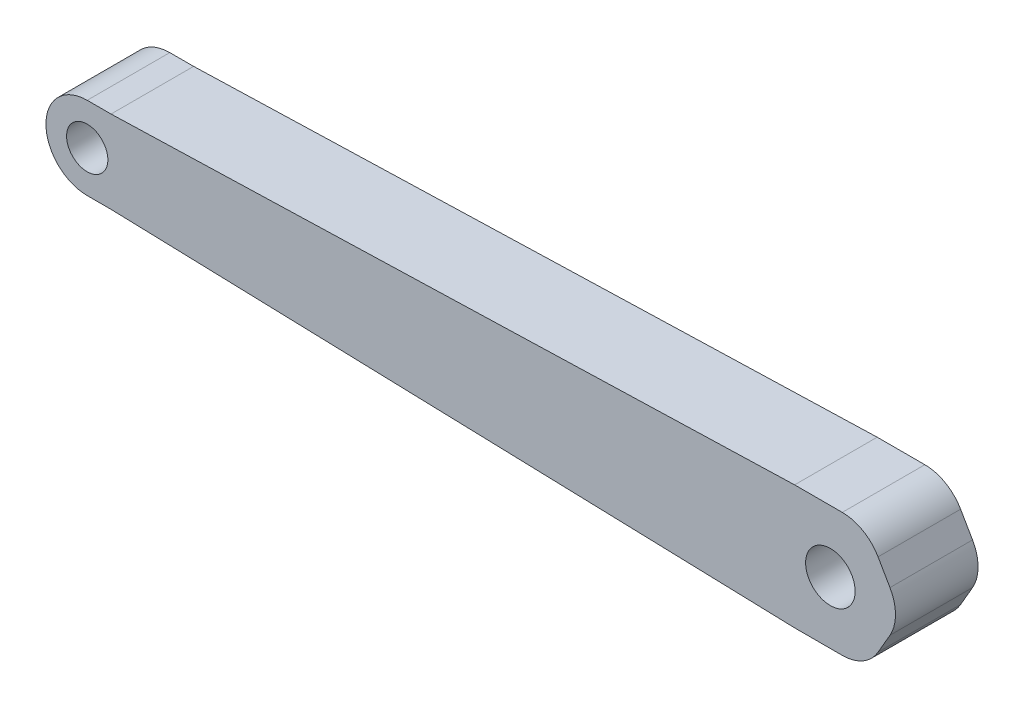
ISO-10303-21;
HEADER;
FILE_DESCRIPTION(('STEP AP214'),'2;1');
FILE_NAME('part.step','',(''),(''),'','','');
FILE_SCHEMA(('AUTOMOTIVE_DESIGN { 1 0 10303 214 1 1 1 1 }'));
ENDSEC;
DATA;
#1=APPLICATION_CONTEXT('core data for automotive mechanical design processes');
#2=APPLICATION_PROTOCOL_DEFINITION('international standard','automotive_design',2000,#1);
#3=PRODUCT_CONTEXT('',#1,'mechanical');
#4=PRODUCT('Part','Part','',(#3));
#5=PRODUCT_RELATED_PRODUCT_CATEGORY('part','',(#4));
#6=PRODUCT_DEFINITION_FORMATION('','',#4);
#7=PRODUCT_DEFINITION_CONTEXT('part definition',#1,'design');
#8=PRODUCT_DEFINITION('design','',#6,#7);
#9=PRODUCT_DEFINITION_SHAPE('','',#8);
#10=(LENGTH_UNIT() NAMED_UNIT(*) SI_UNIT(.MILLI.,.METRE.));
#11=(NAMED_UNIT(*) PLANE_ANGLE_UNIT() SI_UNIT($,.RADIAN.));
#12=(NAMED_UNIT(*) SI_UNIT($,.STERADIAN.) SOLID_ANGLE_UNIT());
#13=UNCERTAINTY_MEASURE_WITH_UNIT(LENGTH_MEASURE(1.E-05),#10,'distance_accuracy_value','');
#14=(GEOMETRIC_REPRESENTATION_CONTEXT(3) GLOBAL_UNCERTAINTY_ASSIGNED_CONTEXT((#13)) GLOBAL_UNIT_ASSIGNED_CONTEXT((#10,
#11,#12)) REPRESENTATION_CONTEXT('',''));
#15=CARTESIAN_POINT('',(0.,0.,0.));
#16=DIRECTION('',(0.,0.,1.));
#17=DIRECTION('',(1.,0.,0.));
#18=AXIS2_PLACEMENT_3D('',#15,#16,#17);
#19=CARTESIAN_POINT('',(0.,-19.05,25.4));
#20=DIRECTION('',(0.,1.,0.));
#21=DIRECTION('',(-1.,0.,0.));
#22=AXIS2_PLACEMENT_3D('',#19,#20,#21);
#23=PLANE('',#22);
#24=DIRECTION('',(1.,0.,0.));
#25=VECTOR('',#24,1.);
#26=CARTESIAN_POINT('',(0.,-19.05,0.));
#27=LINE('',#26,#25);
#28=CARTESIAN_POINT('',(103.301477371938,-19.05,0.));
#29=VERTEX_POINT('',#28);
#30=CARTESIAN_POINT('',(117.966174209354,-19.05,0.));
#31=VERTEX_POINT('',#30);
#32=EDGE_CURVE('E179',#29,#31,#27,.T.);
#33=ORIENTED_EDGE('',*,*,#32,.T.);
#34=DIRECTION('',(0.,0.,-1.));
#35=VECTOR('',#34,1.);
#36=CARTESIAN_POINT('',(117.966174209354,-19.05,25.4));
#37=LINE('',#36,#35);
#38=CARTESIAN_POINT('',(117.966174209354,-19.05,25.4));
#39=VERTEX_POINT('',#38);
#40=EDGE_CURVE('E224',#31,#39,#37,.F.);
#41=ORIENTED_EDGE('',*,*,#40,.T.);
#42=DIRECTION('',(1.,0.,0.));
#43=VECTOR('',#42,1.);
#44=CARTESIAN_POINT('',(0.,-19.05,25.4));
#45=LINE('',#44,#43);
#46=CARTESIAN_POINT('',(103.301477371938,-19.05,25.4));
#47=VERTEX_POINT('',#46);
#48=EDGE_CURVE('E410',#47,#39,#45,.T.);
#49=ORIENTED_EDGE('',*,*,#48,.F.);
#50=DIRECTION('',(0.,0.,-1.));
#51=VECTOR('',#50,1.);
#52=CARTESIAN_POINT('',(103.301477371938,-19.05,25.4));
#53=LINE('',#52,#51);
#54=EDGE_CURVE('E175',#47,#29,#53,.T.);
#55=ORIENTED_EDGE('',*,*,#54,.T.);
#56=EDGE_LOOP('',(#33,#41,#49,#55));
#57=FACE_BOUND('',#56,.T.);
#58=ADVANCED_FACE('F34',(#57),#23,.F.);
#59=CARTESIAN_POINT('',(102.222783942094,-59.0183518262806,25.4));
#60=DIRECTION('',(-0.866025403784439,0.499999999999999,0.));
#61=DIRECTION('',(-0.499999999999999,-0.866025403784439,0.));
#62=AXIS2_PLACEMENT_3D('',#59,#60,#61);
#63=PLANE('',#62);
#64=DIRECTION('',(0.499999999999999,0.866025403784439,0.));
#65=VECTOR('',#64,1.);
#66=CARTESIAN_POINT('',(102.222783942094,-59.0183518262806,25.4));
#67=LINE('',#66,#65);
#68=CARTESIAN_POINT('',(128.964696837416,-12.7,25.4));
#69=VERTEX_POINT('',#68);
#70=CARTESIAN_POINT('',(132.630871046771,-6.34999999999996,25.4));
#71=VERTEX_POINT('',#70);
#72=EDGE_CURVE('E398',#69,#71,#67,.T.);
#73=ORIENTED_EDGE('',*,*,#72,.F.);
#74=DIRECTION('',(0.,0.,-1.));
#75=VECTOR('',#74,1.);
#76=CARTESIAN_POINT('',(128.964696837416,-12.7,25.4));
#77=LINE('',#76,#75);
#78=CARTESIAN_POINT('',(128.964696837416,-12.7,0.));
#79=VERTEX_POINT('',#78);
#80=EDGE_CURVE('E209',#69,#79,#77,.T.);
#81=ORIENTED_EDGE('',*,*,#80,.T.);
#82=DIRECTION('',(0.499999999999999,0.866025403784439,0.));
#83=VECTOR('',#82,1.);
#84=CARTESIAN_POINT('',(102.222783942094,-59.0183518262806,0.));
#85=LINE('',#84,#83);
#86=CARTESIAN_POINT('',(132.630871046771,-6.34999999999996,0.));
#87=VERTEX_POINT('',#86);
#88=EDGE_CURVE('E182',#79,#87,#85,.T.);
#89=ORIENTED_EDGE('',*,*,#88,.T.);
#90=DIRECTION('',(0.,0.,-1.));
#91=VECTOR('',#90,1.);
#92=CARTESIAN_POINT('',(132.630871046771,-6.34999999999997,25.4));
#93=LINE('',#92,#91);
#94=EDGE_CURVE('E158',#87,#71,#93,.F.);
#95=ORIENTED_EDGE('',*,*,#94,.T.);
#96=EDGE_LOOP('',(#73,#81,#89,#95));
#97=FACE_BOUND('',#96,.T.);
#98=ADVANCED_FACE('F274',(#97),#63,.F.);
#99=CARTESIAN_POINT('',(102.222783942094,59.0183518262807,25.4));
#100=DIRECTION('',(-0.866025403784439,-0.5,0.));
#101=DIRECTION('',(0.5,-0.866025403784439,0.));
#102=AXIS2_PLACEMENT_3D('',#99,#100,#101);
#103=PLANE('',#102);
#104=DIRECTION('',(-0.5,0.866025403784439,0.));
#105=VECTOR('',#104,1.);
#106=CARTESIAN_POINT('',(102.222783942094,59.0183518262807,25.4));
#107=LINE('',#106,#105);
#108=CARTESIAN_POINT('',(132.630871046771,6.35000000000002,25.4));
#109=VERTEX_POINT('',#108);
#110=CARTESIAN_POINT('',(128.964696837416,12.7,25.4));
#111=VERTEX_POINT('',#110);
#112=EDGE_CURVE('E148',#109,#111,#107,.T.);
#113=ORIENTED_EDGE('',*,*,#112,.F.);
#114=DIRECTION('',(0.,0.,-1.));
#115=VECTOR('',#114,1.);
#116=CARTESIAN_POINT('',(132.630871046771,6.35000000000002,25.4));
#117=LINE('',#116,#115);
#118=CARTESIAN_POINT('',(132.630871046771,6.35000000000002,0.));
#119=VERTEX_POINT('',#118);
#120=EDGE_CURVE('E237',#109,#119,#117,.T.);
#121=ORIENTED_EDGE('',*,*,#120,.T.);
#122=DIRECTION('',(-0.5,0.866025403784439,0.));
#123=VECTOR('',#122,1.);
#124=CARTESIAN_POINT('',(102.222783942094,59.0183518262807,0.));
#125=LINE('',#124,#123);
#126=CARTESIAN_POINT('',(128.964696837416,12.7,0.));
#127=VERTEX_POINT('',#126);
#128=EDGE_CURVE('E185',#119,#127,#125,.T.);
#129=ORIENTED_EDGE('',*,*,#128,.T.);
#130=DIRECTION('',(0.,0.,-1.));
#131=VECTOR('',#130,1.);
#132=CARTESIAN_POINT('',(128.964696837416,12.7,25.4));
#133=LINE('',#132,#131);
#134=EDGE_CURVE('E235',#127,#111,#133,.F.);
#135=ORIENTED_EDGE('',*,*,#134,.T.);
#136=EDGE_LOOP('',(#113,#121,#129,#135));
#137=FACE_BOUND('',#136,.T.);
#138=ADVANCED_FACE('F280',(#137),#103,.F.);
#139=CARTESIAN_POINT('',(0.,19.05,25.4));
#140=DIRECTION('',(0.,-1.,0.));
#141=DIRECTION('',(0.,0.,-1.));
#142=AXIS2_PLACEMENT_3D('',#139,#140,#141);
#143=PLANE('',#142);
#144=DIRECTION('',(-1.,0.,0.));
#145=VECTOR('',#144,1.);
#146=CARTESIAN_POINT('',(0.,19.05,25.4));
#147=LINE('',#146,#145);
#148=CARTESIAN_POINT('',(117.966174209354,19.05,25.4));
#149=VERTEX_POINT('',#148);
#150=CARTESIAN_POINT('',(103.301477371938,19.05,25.4));
#151=VERTEX_POINT('',#150);
#152=EDGE_CURVE('E134',#149,#151,#147,.T.);
#153=ORIENTED_EDGE('',*,*,#152,.F.);
#154=DIRECTION('',(0.,0.,-1.));
#155=VECTOR('',#154,1.);
#156=CARTESIAN_POINT('',(117.966174209354,19.05,25.4));
#157=LINE('',#156,#155);
#158=CARTESIAN_POINT('',(117.966174209354,19.05,0.));
#159=VERTEX_POINT('',#158);
#160=EDGE_CURVE('E240',#149,#159,#157,.T.);
#161=ORIENTED_EDGE('',*,*,#160,.T.);
#162=DIRECTION('',(-1.,0.,0.));
#163=VECTOR('',#162,1.);
#164=CARTESIAN_POINT('',(0.,19.05,0.));
#165=LINE('',#164,#163);
#166=CARTESIAN_POINT('',(103.301477371938,19.05,0.));
#167=VERTEX_POINT('',#166);
#168=EDGE_CURVE('E154',#159,#167,#165,.T.);
#169=ORIENTED_EDGE('',*,*,#168,.T.);
#170=DIRECTION('',(0.,0.,-1.));
#171=VECTOR('',#170,1.);
#172=CARTESIAN_POINT('',(103.301477371938,19.05,25.4));
#173=LINE('',#172,#171);
#174=EDGE_CURVE('E151',#151,#167,#173,.T.);
#175=ORIENTED_EDGE('',*,*,#174,.F.);
#176=EDGE_LOOP('',(#153,#161,#169,#175));
#177=FACE_BOUND('',#176,.T.);
#178=ADVANCED_FACE('F152',(#177),#143,.F.);
#179=CARTESIAN_POINT('',(-0.480648787503022,15.9158428158561,25.4));
#180=DIRECTION('',(-0.0301856311487905,0.999544310009391,0.));
#181=DIRECTION('',(-0.999544310009391,-0.0301856311487905,0.));
#182=AXIS2_PLACEMENT_3D('',#179,#180,#181);
#183=PLANE('',#182);
#184=DIRECTION('',(0.999544310009391,0.0301856311487905,0.));
#185=VECTOR('',#184,1.);
#186=CARTESIAN_POINT('',(-0.480648787503022,15.9158428158561,0.));
#187=LINE('',#186,#185);
#188=CARTESIAN_POINT('',(-106.967651581292,12.7,0.));
#189=VERTEX_POINT('',#188);
#190=EDGE_CURVE('E189',#189,#167,#187,.T.);
#191=ORIENTED_EDGE('',*,*,#190,.F.);
#192=DIRECTION('',(0.,0.,-1.));
#193=VECTOR('',#192,1.);
#194=CARTESIAN_POINT('',(-106.967651581292,12.7,25.4));
#195=LINE('',#194,#193);
#196=CARTESIAN_POINT('',(-106.967651581292,12.7,25.4));
#197=VERTEX_POINT('',#196);
#198=EDGE_CURVE('E159',#197,#189,#195,.T.);
#199=ORIENTED_EDGE('',*,*,#198,.F.);
#200=DIRECTION('',(0.999544310009391,0.0301856311487905,0.));
#201=VECTOR('',#200,1.);
#202=CARTESIAN_POINT('',(-0.480648787503022,15.9158428158561,25.4));
#203=LINE('',#202,#201);
#204=EDGE_CURVE('E141',#197,#151,#203,.T.);
#205=ORIENTED_EDGE('',*,*,#204,.T.);
#206=ORIENTED_EDGE('',*,*,#174,.T.);
#207=EDGE_LOOP('',(#191,#199,#205,#206));
#208=FACE_BOUND('',#207,.T.);
#209=ADVANCED_FACE('F161',(#208),#183,.T.);
#210=CARTESIAN_POINT('',(0.,12.7,25.4));
#211=DIRECTION('',(0.,-1.,0.));
#212=DIRECTION('',(1.,0.,0.));
#213=AXIS2_PLACEMENT_3D('',#210,#211,#212);
#214=PLANE('',#213);
#215=DIRECTION('',(-1.,0.,0.));
#216=VECTOR('',#215,1.);
#217=CARTESIAN_POINT('',(0.,12.7,0.));
#218=LINE('',#217,#216);
#219=CARTESIAN_POINT('',(-114.3,12.7,0.));
#220=VERTEX_POINT('',#219);
#221=EDGE_CURVE('E191',#189,#220,#218,.T.);
#222=ORIENTED_EDGE('',*,*,#221,.T.);
#223=DIRECTION('',(0.,0.,-1.));
#224=VECTOR('',#223,1.);
#225=CARTESIAN_POINT('',(-114.3,12.7,25.4));
#226=LINE('',#225,#224);
#227=CARTESIAN_POINT('',(-114.3,12.7,25.4));
#228=VERTEX_POINT('',#227);
#229=EDGE_CURVE('E11',#220,#228,#226,.F.);
#230=ORIENTED_EDGE('',*,*,#229,.T.);
#231=DIRECTION('',(-1.,0.,0.));
#232=VECTOR('',#231,1.);
#233=CARTESIAN_POINT('',(0.,12.7,25.4));
#234=LINE('',#233,#232);
#235=EDGE_CURVE('E163',#197,#228,#234,.T.);
#236=ORIENTED_EDGE('',*,*,#235,.F.);
#237=ORIENTED_EDGE('',*,*,#198,.T.);
#238=EDGE_LOOP('',(#222,#230,#236,#237));
#239=FACE_BOUND('',#238,.T.);
#240=ADVANCED_FACE('F261',(#239),#214,.F.);
#241=CARTESIAN_POINT('',(0.,-12.7,25.4));
#242=DIRECTION('',(0.,1.,0.));
#243=DIRECTION('',(-1.,0.,0.));
#244=AXIS2_PLACEMENT_3D('',#241,#242,#243);
#245=PLANE('',#244);
#246=DIRECTION('',(1.,0.,0.));
#247=VECTOR('',#246,1.);
#248=CARTESIAN_POINT('',(0.,-12.7,25.4));
#249=LINE('',#248,#247);
#250=CARTESIAN_POINT('',(-114.3,-12.7,25.4));
#251=VERTEX_POINT('',#250);
#252=CARTESIAN_POINT('',(-106.967651581292,-12.7,25.4));
#253=VERTEX_POINT('',#252);
#254=EDGE_CURVE('E165',#251,#253,#249,.T.);
#255=ORIENTED_EDGE('',*,*,#254,.F.);
#256=DIRECTION('',(0.,0.,-1.));
#257=VECTOR('',#256,1.);
#258=CARTESIAN_POINT('',(-114.3,-12.7,25.4));
#259=LINE('',#258,#257);
#260=CARTESIAN_POINT('',(-114.3,-12.7,0.));
#261=VERTEX_POINT('',#260);
#262=EDGE_CURVE('E43',#251,#261,#259,.T.);
#263=ORIENTED_EDGE('',*,*,#262,.T.);
#264=DIRECTION('',(1.,0.,0.));
#265=VECTOR('',#264,1.);
#266=CARTESIAN_POINT('',(0.,-12.7,0.));
#267=LINE('',#266,#265);
#268=CARTESIAN_POINT('',(-106.967651581292,-12.7,0.));
#269=VERTEX_POINT('',#268);
#270=EDGE_CURVE('E194',#261,#269,#267,.T.);
#271=ORIENTED_EDGE('',*,*,#270,.T.);
#272=DIRECTION('',(0.,0.,-1.));
#273=VECTOR('',#272,1.);
#274=CARTESIAN_POINT('',(-106.967651581292,-12.7,25.4));
#275=LINE('',#274,#273);
#276=EDGE_CURVE('E204',#253,#269,#275,.T.);
#277=ORIENTED_EDGE('',*,*,#276,.F.);
#278=EDGE_LOOP('',(#255,#263,#271,#277));
#279=FACE_BOUND('',#278,.T.);
#280=ADVANCED_FACE('F263',(#279),#245,.F.);
#281=CARTESIAN_POINT('',(-0.480648787503021,-15.9158428158561,25.4));
#282=DIRECTION('',(0.0301856311487904,0.999544310009391,0.));
#283=DIRECTION('',(-0.999544310009391,0.0301856311487904,0.));
#284=AXIS2_PLACEMENT_3D('',#281,#282,#283);
#285=PLANE('',#284);
#286=DIRECTION('',(0.999544310009391,-0.0301856311487904,0.));
#287=VECTOR('',#286,1.);
#288=CARTESIAN_POINT('',(-0.480648787503021,-15.9158428158561,0.));
#289=LINE('',#288,#287);
#290=EDGE_CURVE('E196',#269,#29,#289,.T.);
#291=ORIENTED_EDGE('',*,*,#290,.T.);
#292=ORIENTED_EDGE('',*,*,#54,.F.);
#293=DIRECTION('',(0.999544310009391,-0.0301856311487904,0.));
#294=VECTOR('',#293,1.);
#295=CARTESIAN_POINT('',(-0.480648787503021,-15.9158428158561,25.4));
#296=LINE('',#295,#294);
#297=EDGE_CURVE('E170',#253,#47,#296,.T.);
#298=ORIENTED_EDGE('',*,*,#297,.F.);
#299=ORIENTED_EDGE('',*,*,#276,.T.);
#300=EDGE_LOOP('',(#291,#292,#298,#299));
#301=FACE_BOUND('',#300,.T.);
#302=ADVANCED_FACE('F269',(#301),#285,.F.);
#303=CARTESIAN_POINT('',(114.3,0.,25.4));
#304=DIRECTION('',(0.,0.,-1.));
#305=DIRECTION('',(-1.,0.,0.));
#306=AXIS2_PLACEMENT_3D('',#303,#304,#305);
#307=CYLINDRICAL_SURFACE('',#306,7.62);
#308=CARTESIAN_POINT('',(114.3,0.,25.4));
#309=DIRECTION('',(0.,0.,1.));
#310=DIRECTION('',(1.,0.,0.));
#311=AXIS2_PLACEMENT_3D('',#308,#309,#310);
#312=CIRCLE('',#311,7.62);
#313=CARTESIAN_POINT('',(121.92,0.,25.4));
#314=VERTEX_POINT('',#313);
#315=EDGE_CURVE('E201',#314,#314,#312,.T.);
#316=ORIENTED_EDGE('',*,*,#315,.T.);
#317=EDGE_LOOP('',(#316));
#318=FACE_BOUND('',#317,.T.);
#319=CARTESIAN_POINT('',(114.3,0.,0.));
#320=DIRECTION('',(0.,0.,1.));
#321=DIRECTION('',(1.,0.,0.));
#322=AXIS2_PLACEMENT_3D('',#319,#320,#321);
#323=CIRCLE('',#322,7.62);
#324=CARTESIAN_POINT('',(121.92,0.,0.));
#325=VERTEX_POINT('',#324);
#326=EDGE_CURVE('E176',#325,#325,#323,.T.);
#327=ORIENTED_EDGE('',*,*,#326,.F.);
#328=EDGE_LOOP('',(#327));
#329=FACE_BOUND('',#328,.T.);
#330=ADVANCED_FACE('F285',(#318,#329),#307,.F.);
#331=CARTESIAN_POINT('',(-114.3,0.,25.4));
#332=DIRECTION('',(0.,0.,-1.));
#333=DIRECTION('',(-1.,0.,0.));
#334=AXIS2_PLACEMENT_3D('',#331,#332,#333);
#335=CYLINDRICAL_SURFACE('',#334,6.35);
#336=CARTESIAN_POINT('',(-114.3,0.,25.4));
#337=DIRECTION('',(0.,0.,1.));
#338=DIRECTION('',(1.,0.,0.));
#339=AXIS2_PLACEMENT_3D('',#336,#337,#338);
#340=CIRCLE('',#339,6.35);
#341=CARTESIAN_POINT('',(-107.95,0.,25.4));
#342=VERTEX_POINT('',#341);
#343=EDGE_CURVE('E172',#342,#342,#340,.T.);
#344=ORIENTED_EDGE('',*,*,#343,.T.);
#345=EDGE_LOOP('',(#344));
#346=FACE_BOUND('',#345,.T.);
#347=CARTESIAN_POINT('',(-114.3,0.,0.));
#348=DIRECTION('',(0.,0.,1.));
#349=DIRECTION('',(1.,0.,0.));
#350=AXIS2_PLACEMENT_3D('',#347,#348,#349);
#351=CIRCLE('',#350,6.35);
#352=CARTESIAN_POINT('',(-107.95,0.,0.));
#353=VERTEX_POINT('',#352);
#354=EDGE_CURVE('E198',#353,#353,#351,.T.);
#355=ORIENTED_EDGE('',*,*,#354,.F.);
#356=EDGE_LOOP('',(#355));
#357=FACE_BOUND('',#356,.T.);
#358=ADVANCED_FACE('F288',(#346,#357),#335,.F.);
#359=CARTESIAN_POINT('',(0.,0.,25.4));
#360=DIRECTION('',(0.,0.,1.));
#361=DIRECTION('',(1.,0.,0.));
#362=AXIS2_PLACEMENT_3D('',#359,#360,#361);
#363=PLANE('',#362);
#364=ORIENTED_EDGE('',*,*,#315,.F.);
#365=EDGE_LOOP('',(#364));
#366=FACE_BOUND('',#365,.T.);
#367=ORIENTED_EDGE('',*,*,#48,.T.);
#368=CARTESIAN_POINT('',(117.966174209354,-6.35000000000002,25.4));
#369=DIRECTION('',(0.,0.,1.));
#370=DIRECTION('',(1.,0.,0.));
#371=AXIS2_PLACEMENT_3D('',#368,#369,#370);
#372=CIRCLE('',#371,12.7);
#373=EDGE_CURVE('E233',#39,#69,#372,.T.);
#374=ORIENTED_EDGE('',*,*,#373,.T.);
#375=ORIENTED_EDGE('',*,*,#72,.T.);
#376=CARTESIAN_POINT('',(121.632348418708,0.,25.4));
#377=DIRECTION('',(0.,0.,1.));
#378=DIRECTION('',(1.,0.,0.));
#379=AXIS2_PLACEMENT_3D('',#376,#377,#378);
#380=CIRCLE('',#379,12.7);
#381=EDGE_CURVE('E231',#71,#109,#380,.T.);
#382=ORIENTED_EDGE('',*,*,#381,.T.);
#383=ORIENTED_EDGE('',*,*,#112,.T.);
#384=CARTESIAN_POINT('',(117.966174209354,6.35,25.4));
#385=DIRECTION('',(0.,0.,1.));
#386=DIRECTION('',(1.,0.,0.));
#387=AXIS2_PLACEMENT_3D('',#384,#385,#386);
#388=CIRCLE('',#387,12.7);
#389=EDGE_CURVE('E144',#111,#149,#388,.T.);
#390=ORIENTED_EDGE('',*,*,#389,.T.);
#391=ORIENTED_EDGE('',*,*,#152,.T.);
#392=ORIENTED_EDGE('',*,*,#204,.F.);
#393=ORIENTED_EDGE('',*,*,#235,.T.);
#394=CARTESIAN_POINT('',(-114.3,0.,25.4));
#395=DIRECTION('',(0.,0.,1.));
#396=DIRECTION('',(1.,0.,0.));
#397=AXIS2_PLACEMENT_3D('',#394,#395,#396);
#398=CIRCLE('',#397,12.7);
#399=CARTESIAN_POINT('',(-125.298522628062,6.34999999999998,25.4));
#400=VERTEX_POINT('',#399);
#401=EDGE_CURVE('E226',#228,#400,#398,.T.);
#402=ORIENTED_EDGE('',*,*,#401,.T.);
#403=CARTESIAN_POINT('',(-114.3,0.,25.4));
#404=DIRECTION('',(0.,0.,1.));
#405=DIRECTION('',(1.,0.,0.));
#406=AXIS2_PLACEMENT_3D('',#403,#404,#405);
#407=CIRCLE('',#406,12.7);
#408=CARTESIAN_POINT('',(-125.298522628062,-6.35000000000002,25.4));
#409=VERTEX_POINT('',#408);
#410=EDGE_CURVE('E56',#400,#409,#407,.T.);
#411=ORIENTED_EDGE('',*,*,#410,.T.);
#412=CARTESIAN_POINT('',(-114.3,0.,25.4));
#413=DIRECTION('',(0.,0.,1.));
#414=DIRECTION('',(1.,0.,0.));
#415=AXIS2_PLACEMENT_3D('',#412,#413,#414);
#416=CIRCLE('',#415,12.7);
#417=EDGE_CURVE('E51',#409,#251,#416,.T.);
#418=ORIENTED_EDGE('',*,*,#417,.T.);
#419=ORIENTED_EDGE('',*,*,#254,.T.);
#420=ORIENTED_EDGE('',*,*,#297,.T.);
#421=EDGE_LOOP('',(#367,#374,#375,#382,#383,#390,#391,#392,#393,#402,#411,#418,#419,#420));
#422=FACE_BOUND('',#421,.T.);
#423=ORIENTED_EDGE('',*,*,#343,.F.);
#424=EDGE_LOOP('',(#423));
#425=FACE_BOUND('',#424,.T.);
#426=ADVANCED_FACE('F137',(#366,#422,#425),#363,.T.);
#427=CARTESIAN_POINT('',(0.,0.,0.));
#428=DIRECTION('',(0.,0.,1.));
#429=DIRECTION('',(1.,0.,0.));
#430=AXIS2_PLACEMENT_3D('',#427,#428,#429);
#431=PLANE('',#430);
#432=ORIENTED_EDGE('',*,*,#326,.T.);
#433=EDGE_LOOP('',(#432));
#434=FACE_BOUND('',#433,.T.);
#435=ORIENTED_EDGE('',*,*,#88,.F.);
#436=CARTESIAN_POINT('',(117.966174209354,-6.35000000000002,0.));
#437=DIRECTION('',(0.,0.,1.));
#438=DIRECTION('',(1.,0.,0.));
#439=AXIS2_PLACEMENT_3D('',#436,#437,#438);
#440=CIRCLE('',#439,12.7);
#441=EDGE_CURVE('E222',#79,#31,#440,.F.);
#442=ORIENTED_EDGE('',*,*,#441,.T.);
#443=ORIENTED_EDGE('',*,*,#32,.F.);
#444=ORIENTED_EDGE('',*,*,#290,.F.);
#445=ORIENTED_EDGE('',*,*,#270,.F.);
#446=CARTESIAN_POINT('',(-114.3,0.,0.));
#447=DIRECTION('',(0.,0.,1.));
#448=DIRECTION('',(1.,0.,0.));
#449=AXIS2_PLACEMENT_3D('',#446,#447,#448);
#450=CIRCLE('',#449,12.7);
#451=CARTESIAN_POINT('',(-125.298522628062,-6.35000000000002,0.));
#452=VERTEX_POINT('',#451);
#453=EDGE_CURVE('E216',#261,#452,#450,.F.);
#454=ORIENTED_EDGE('',*,*,#453,.T.);
#455=CARTESIAN_POINT('',(-114.3,0.,0.));
#456=DIRECTION('',(0.,0.,1.));
#457=DIRECTION('',(1.,0.,0.));
#458=AXIS2_PLACEMENT_3D('',#455,#456,#457);
#459=CIRCLE('',#458,12.7);
#460=CARTESIAN_POINT('',(-125.298522628062,6.34999999999998,0.));
#461=VERTEX_POINT('',#460);
#462=EDGE_CURVE('E214',#452,#461,#459,.F.);
#463=ORIENTED_EDGE('',*,*,#462,.T.);
#464=CARTESIAN_POINT('',(-114.3,0.,0.));
#465=DIRECTION('',(0.,0.,1.));
#466=DIRECTION('',(1.,0.,0.));
#467=AXIS2_PLACEMENT_3D('',#464,#465,#466);
#468=CIRCLE('',#467,12.7);
#469=EDGE_CURVE('E212',#461,#220,#468,.F.);
#470=ORIENTED_EDGE('',*,*,#469,.T.);
#471=ORIENTED_EDGE('',*,*,#221,.F.);
#472=ORIENTED_EDGE('',*,*,#190,.T.);
#473=ORIENTED_EDGE('',*,*,#168,.F.);
#474=CARTESIAN_POINT('',(117.966174209354,6.35,0.));
#475=DIRECTION('',(0.,0.,1.));
#476=DIRECTION('',(1.,0.,0.));
#477=AXIS2_PLACEMENT_3D('',#474,#475,#476);
#478=CIRCLE('',#477,12.7);
#479=EDGE_CURVE('E218',#159,#127,#478,.F.);
#480=ORIENTED_EDGE('',*,*,#479,.T.);
#481=ORIENTED_EDGE('',*,*,#128,.F.);
#482=CARTESIAN_POINT('',(121.632348418708,0.,0.));
#483=DIRECTION('',(0.,0.,1.));
#484=DIRECTION('',(1.,0.,0.));
#485=AXIS2_PLACEMENT_3D('',#482,#483,#484);
#486=CIRCLE('',#485,12.7);
#487=EDGE_CURVE('E220',#119,#87,#486,.F.);
#488=ORIENTED_EDGE('',*,*,#487,.T.);
#489=EDGE_LOOP('',(#435,#442,#443,#444,#445,#454,#463,#470,#471,#472,#473,#480,#481,#488));
#490=FACE_BOUND('',#489,.T.);
#491=ORIENTED_EDGE('',*,*,#354,.T.);
#492=EDGE_LOOP('',(#491));
#493=FACE_BOUND('',#492,.T.);
#494=ADVANCED_FACE('F258',(#434,#490,#493),#431,.F.);
#495=CARTESIAN_POINT('',(117.966174209354,-6.35000000000002,25.4));
#496=DIRECTION('',(0.,0.,-1.));
#497=DIRECTION('',(-1.,0.,0.));
#498=AXIS2_PLACEMENT_3D('',#495,#496,#497);
#499=CYLINDRICAL_SURFACE('',#498,12.7);
#500=ORIENTED_EDGE('',*,*,#373,.F.);
#501=ORIENTED_EDGE('',*,*,#40,.F.);
#502=ORIENTED_EDGE('',*,*,#441,.F.);
#503=ORIENTED_EDGE('',*,*,#80,.F.);
#504=EDGE_LOOP('',(#500,#501,#502,#503));
#505=FACE_BOUND('',#504,.T.);
#506=ADVANCED_FACE('F290',(#505),#499,.T.);
#507=CARTESIAN_POINT('',(121.632348418708,0.,25.4));
#508=DIRECTION('',(0.,0.,-1.));
#509=DIRECTION('',(-1.,0.,0.));
#510=AXIS2_PLACEMENT_3D('',#507,#508,#509);
#511=CYLINDRICAL_SURFACE('',#510,12.7);
#512=ORIENTED_EDGE('',*,*,#381,.F.);
#513=ORIENTED_EDGE('',*,*,#94,.F.);
#514=ORIENTED_EDGE('',*,*,#487,.F.);
#515=ORIENTED_EDGE('',*,*,#120,.F.);
#516=EDGE_LOOP('',(#512,#513,#514,#515));
#517=FACE_BOUND('',#516,.T.);
#518=ADVANCED_FACE('F293',(#517),#511,.T.);
#519=CARTESIAN_POINT('',(117.966174209354,6.35,25.4));
#520=DIRECTION('',(0.,0.,-1.));
#521=DIRECTION('',(-1.,0.,0.));
#522=AXIS2_PLACEMENT_3D('',#519,#520,#521);
#523=CYLINDRICAL_SURFACE('',#522,12.7);
#524=ORIENTED_EDGE('',*,*,#389,.F.);
#525=ORIENTED_EDGE('',*,*,#134,.F.);
#526=ORIENTED_EDGE('',*,*,#479,.F.);
#527=ORIENTED_EDGE('',*,*,#160,.F.);
#528=EDGE_LOOP('',(#524,#525,#526,#527));
#529=FACE_BOUND('',#528,.T.);
#530=ADVANCED_FACE('F297',(#529),#523,.T.);
#531=CARTESIAN_POINT('',(-114.3,0.,25.4));
#532=DIRECTION('',(0.,0.,-1.));
#533=DIRECTION('',(-1.,0.,0.));
#534=AXIS2_PLACEMENT_3D('',#531,#532,#533);
#535=CYLINDRICAL_SURFACE('',#534,12.7);
#536=ORIENTED_EDGE('',*,*,#229,.F.);
#537=ORIENTED_EDGE('',*,*,#469,.F.);
#538=DIRECTION('',(0.,0.,-1.));
#539=VECTOR('',#538,1.);
#540=CARTESIAN_POINT('',(-125.298522628062,6.34999999999999,25.4));
#541=LINE('',#540,#539);
#542=EDGE_CURVE('E38',#400,#461,#541,.T.);
#543=ORIENTED_EDGE('',*,*,#542,.F.);
#544=ORIENTED_EDGE('',*,*,#401,.F.);
#545=EDGE_LOOP('',(#536,#537,#543,#544));
#546=FACE_BOUND('',#545,.T.);
#547=ADVANCED_FACE('F36',(#546),#535,.T.);
#548=CARTESIAN_POINT('',(-114.3,0.,25.4));
#549=DIRECTION('',(0.,0.,-1.));
#550=DIRECTION('',(-1.,0.,0.));
#551=AXIS2_PLACEMENT_3D('',#548,#549,#550);
#552=CYLINDRICAL_SURFACE('',#551,12.7);
#553=DIRECTION('',(0.,0.,-1.));
#554=VECTOR('',#553,1.);
#555=CARTESIAN_POINT('',(-125.298522628062,-6.35000000000003,25.4));
#556=LINE('',#555,#554);
#557=EDGE_CURVE('E243',#409,#452,#556,.T.);
#558=ORIENTED_EDGE('',*,*,#557,.F.);
#559=ORIENTED_EDGE('',*,*,#410,.F.);
#560=ORIENTED_EDGE('',*,*,#542,.T.);
#561=ORIENTED_EDGE('',*,*,#462,.F.);
#562=EDGE_LOOP('',(#558,#559,#560,#561));
#563=FACE_BOUND('',#562,.T.);
#564=ADVANCED_FACE('F250',(#563),#552,.T.);
#565=CARTESIAN_POINT('',(-114.3,0.,25.4));
#566=DIRECTION('',(0.,0.,-1.));
#567=DIRECTION('',(-1.,0.,0.));
#568=AXIS2_PLACEMENT_3D('',#565,#566,#567);
#569=CYLINDRICAL_SURFACE('',#568,12.7);
#570=ORIENTED_EDGE('',*,*,#417,.F.);
#571=ORIENTED_EDGE('',*,*,#557,.T.);
#572=ORIENTED_EDGE('',*,*,#453,.F.);
#573=ORIENTED_EDGE('',*,*,#262,.F.);
#574=EDGE_LOOP('',(#570,#571,#572,#573));
#575=FACE_BOUND('',#574,.T.);
#576=ADVANCED_FACE('F302',(#575),#569,.T.);
#577=CLOSED_SHELL('',(#58,#98,#138,#178,#209,#240,#280,#302,#330,#358,#426,#494,#506,#518,#530,
#547,#564,#576));
#578=MANIFOLD_SOLID_BREP('B2',#577);
#579=ADVANCED_BREP_SHAPE_REPRESENTATION('',(#18,#578),#14);
#580=SHAPE_DEFINITION_REPRESENTATION(#9,#579);
ENDSEC;
END-ISO-10303-21;
